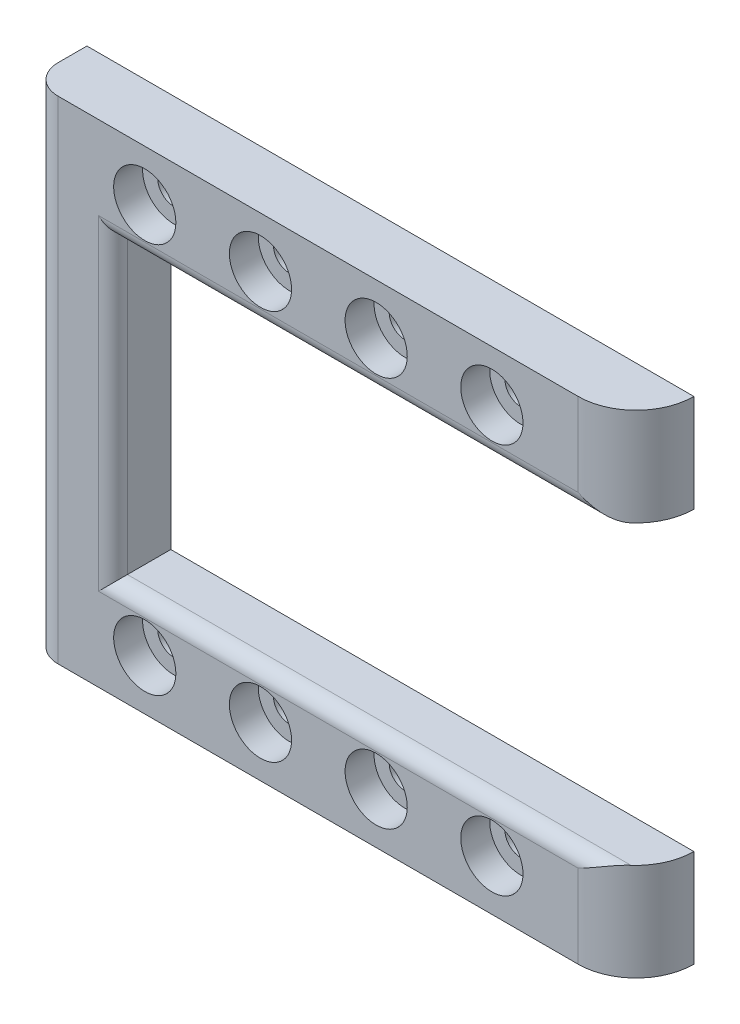
ISO-10303-21;
HEADER;
FILE_DESCRIPTION(('STEP AP214'),'2;1');
FILE_NAME('part.step','',(''),(''),'','','');
FILE_SCHEMA(('AUTOMOTIVE_DESIGN { 1 0 10303 214 1 1 1 1 }'));
ENDSEC;
DATA;
#1=APPLICATION_CONTEXT('core data for automotive mechanical design processes');
#2=APPLICATION_PROTOCOL_DEFINITION('international standard','automotive_design',2000,#1);
#3=PRODUCT_CONTEXT('',#1,'mechanical');
#4=PRODUCT('Part','Part','',(#3));
#5=PRODUCT_RELATED_PRODUCT_CATEGORY('part','',(#4));
#6=PRODUCT_DEFINITION_FORMATION('','',#4);
#7=PRODUCT_DEFINITION_CONTEXT('part definition',#1,'design');
#8=PRODUCT_DEFINITION('design','',#6,#7);
#9=PRODUCT_DEFINITION_SHAPE('','',#8);
#10=(LENGTH_UNIT() NAMED_UNIT(*) SI_UNIT(.MILLI.,.METRE.));
#11=(NAMED_UNIT(*) PLANE_ANGLE_UNIT() SI_UNIT($,.RADIAN.));
#12=(NAMED_UNIT(*) SI_UNIT($,.STERADIAN.) SOLID_ANGLE_UNIT());
#13=UNCERTAINTY_MEASURE_WITH_UNIT(LENGTH_MEASURE(1.E-05),#10,'distance_accuracy_value','');
#14=(GEOMETRIC_REPRESENTATION_CONTEXT(3) GLOBAL_UNCERTAINTY_ASSIGNED_CONTEXT((#13)) GLOBAL_UNIT_ASSIGNED_CONTEXT((#10,
#11,#12)) REPRESENTATION_CONTEXT('',''));
#15=CARTESIAN_POINT('',(0.,0.,0.));
#16=DIRECTION('',(0.,0.,1.));
#17=DIRECTION('',(1.,0.,0.));
#18=AXIS2_PLACEMENT_3D('',#15,#16,#17);
#19=CARTESIAN_POINT('',(-11.25,-13.5,4.));
#20=DIRECTION('',(0.,0.,-1.));
#21=DIRECTION('',(-1.,0.,0.));
#22=AXIS2_PLACEMENT_3D('',#19,#20,#21);
#23=CYLINDRICAL_SURFACE('',#22,1.1);
#24=CARTESIAN_POINT('',(-11.25,-13.5,0.));
#25=DIRECTION('',(0.,0.,1.));
#26=DIRECTION('',(-1.,0.,0.));
#27=AXIS2_PLACEMENT_3D('',#24,#25,#26);
#28=CIRCLE('',#27,1.1);
#29=CARTESIAN_POINT('',(-12.35,-13.5,0.));
#30=VERTEX_POINT('',#29);
#31=EDGE_CURVE('E359',#30,#30,#28,.T.);
#32=ORIENTED_EDGE('',*,*,#31,.F.);
#33=EDGE_LOOP('',(#32));
#34=FACE_BOUND('',#33,.T.);
#35=CARTESIAN_POINT('',(-11.25,-13.5,2.));
#36=DIRECTION('',(0.,0.,1.));
#37=DIRECTION('',(1.,0.,0.));
#38=AXIS2_PLACEMENT_3D('',#35,#36,#37);
#39=CIRCLE('',#38,1.1);
#40=CARTESIAN_POINT('',(-10.15,-13.5,2.));
#41=VERTEX_POINT('',#40);
#42=EDGE_CURVE('E296',#41,#41,#39,.T.);
#43=ORIENTED_EDGE('',*,*,#42,.T.);
#44=EDGE_LOOP('',(#43));
#45=FACE_BOUND('',#44,.T.);
#46=ADVANCED_FACE('F34',(#34,#45),#23,.F.);
#47=CARTESIAN_POINT('',(-3.25,-13.5,4.));
#48=DIRECTION('',(0.,0.,-1.));
#49=DIRECTION('',(-1.,0.,0.));
#50=AXIS2_PLACEMENT_3D('',#47,#48,#49);
#51=CYLINDRICAL_SURFACE('',#50,1.1);
#52=CARTESIAN_POINT('',(-3.25,-13.5,0.));
#53=DIRECTION('',(0.,0.,1.));
#54=DIRECTION('',(-1.,0.,0.));
#55=AXIS2_PLACEMENT_3D('',#52,#53,#54);
#56=CIRCLE('',#55,1.1);
#57=CARTESIAN_POINT('',(-4.35,-13.5,0.));
#58=VERTEX_POINT('',#57);
#59=EDGE_CURVE('E356',#58,#58,#56,.T.);
#60=ORIENTED_EDGE('',*,*,#59,.F.);
#61=EDGE_LOOP('',(#60));
#62=FACE_BOUND('',#61,.T.);
#63=CARTESIAN_POINT('',(-3.25,-13.5,2.));
#64=DIRECTION('',(0.,0.,1.));
#65=DIRECTION('',(1.,0.,0.));
#66=AXIS2_PLACEMENT_3D('',#63,#64,#65);
#67=CIRCLE('',#66,1.1);
#68=CARTESIAN_POINT('',(-2.15,-13.5,2.));
#69=VERTEX_POINT('',#68);
#70=EDGE_CURVE('E301',#69,#69,#67,.T.);
#71=ORIENTED_EDGE('',*,*,#70,.T.);
#72=EDGE_LOOP('',(#71));
#73=FACE_BOUND('',#72,.T.);
#74=ADVANCED_FACE('F192',(#62,#73),#51,.F.);
#75=CARTESIAN_POINT('',(4.75,-13.5,4.));
#76=DIRECTION('',(0.,0.,-1.));
#77=DIRECTION('',(-1.,0.,0.));
#78=AXIS2_PLACEMENT_3D('',#75,#76,#77);
#79=CYLINDRICAL_SURFACE('',#78,1.1);
#80=CARTESIAN_POINT('',(4.75,-13.5,0.));
#81=DIRECTION('',(0.,0.,1.));
#82=DIRECTION('',(-1.,0.,0.));
#83=AXIS2_PLACEMENT_3D('',#80,#81,#82);
#84=CIRCLE('',#83,1.1);
#85=CARTESIAN_POINT('',(3.65,-13.5,0.));
#86=VERTEX_POINT('',#85);
#87=EDGE_CURVE('E353',#86,#86,#84,.T.);
#88=ORIENTED_EDGE('',*,*,#87,.F.);
#89=EDGE_LOOP('',(#88));
#90=FACE_BOUND('',#89,.T.);
#91=CARTESIAN_POINT('',(4.75,-13.5,2.));
#92=DIRECTION('',(0.,0.,1.));
#93=DIRECTION('',(1.,0.,0.));
#94=AXIS2_PLACEMENT_3D('',#91,#92,#93);
#95=CIRCLE('',#94,1.1);
#96=CARTESIAN_POINT('',(5.85,-13.5,2.));
#97=VERTEX_POINT('',#96);
#98=EDGE_CURVE('E308',#97,#97,#95,.T.);
#99=ORIENTED_EDGE('',*,*,#98,.T.);
#100=EDGE_LOOP('',(#99));
#101=FACE_BOUND('',#100,.T.);
#102=ADVANCED_FACE('F198',(#90,#101),#79,.F.);
#103=CARTESIAN_POINT('',(12.75,-13.5,4.));
#104=DIRECTION('',(0.,0.,-1.));
#105=DIRECTION('',(-1.,0.,0.));
#106=AXIS2_PLACEMENT_3D('',#103,#104,#105);
#107=CYLINDRICAL_SURFACE('',#106,1.1);
#108=CARTESIAN_POINT('',(12.75,-13.5,0.));
#109=DIRECTION('',(0.,0.,1.));
#110=DIRECTION('',(-1.,0.,0.));
#111=AXIS2_PLACEMENT_3D('',#108,#109,#110);
#112=CIRCLE('',#111,1.1);
#113=CARTESIAN_POINT('',(11.65,-13.5,0.));
#114=VERTEX_POINT('',#113);
#115=EDGE_CURVE('E349',#114,#114,#112,.T.);
#116=ORIENTED_EDGE('',*,*,#115,.F.);
#117=EDGE_LOOP('',(#116));
#118=FACE_BOUND('',#117,.T.);
#119=CARTESIAN_POINT('',(12.75,-13.5,2.));
#120=DIRECTION('',(0.,0.,1.));
#121=DIRECTION('',(1.,0.,0.));
#122=AXIS2_PLACEMENT_3D('',#119,#120,#121);
#123=CIRCLE('',#122,1.1);
#124=CARTESIAN_POINT('',(13.85,-13.5,2.));
#125=VERTEX_POINT('',#124);
#126=EDGE_CURVE('E315',#125,#125,#123,.T.);
#127=ORIENTED_EDGE('',*,*,#126,.T.);
#128=EDGE_LOOP('',(#127));
#129=FACE_BOUND('',#128,.T.);
#130=ADVANCED_FACE('F209',(#118,#129),#107,.F.);
#131=CARTESIAN_POINT('',(-11.25,13.5,4.));
#132=DIRECTION('',(0.,0.,-1.));
#133=DIRECTION('',(-1.,0.,0.));
#134=AXIS2_PLACEMENT_3D('',#131,#132,#133);
#135=CYLINDRICAL_SURFACE('',#134,1.1);
#136=CARTESIAN_POINT('',(-11.25,13.5,0.));
#137=DIRECTION('',(0.,0.,1.));
#138=DIRECTION('',(1.,0.,0.));
#139=AXIS2_PLACEMENT_3D('',#136,#137,#138);
#140=CIRCLE('',#139,1.1);
#141=CARTESIAN_POINT('',(-10.15,13.5,0.));
#142=VERTEX_POINT('',#141);
#143=EDGE_CURVE('E362',#142,#142,#140,.T.);
#144=ORIENTED_EDGE('',*,*,#143,.F.);
#145=EDGE_LOOP('',(#144));
#146=FACE_BOUND('',#145,.T.);
#147=CARTESIAN_POINT('',(-11.25,13.5,2.));
#148=DIRECTION('',(0.,0.,1.));
#149=DIRECTION('',(1.,0.,0.));
#150=AXIS2_PLACEMENT_3D('',#147,#148,#149);
#151=CIRCLE('',#150,1.1);
#152=CARTESIAN_POINT('',(-10.15,13.5,2.));
#153=VERTEX_POINT('',#152);
#154=EDGE_CURVE('E322',#153,#153,#151,.T.);
#155=ORIENTED_EDGE('',*,*,#154,.T.);
#156=EDGE_LOOP('',(#155));
#157=FACE_BOUND('',#156,.T.);
#158=ADVANCED_FACE('F205',(#146,#157),#135,.F.);
#159=CARTESIAN_POINT('',(-3.25,13.5,4.));
#160=DIRECTION('',(0.,0.,-1.));
#161=DIRECTION('',(-1.,0.,0.));
#162=AXIS2_PLACEMENT_3D('',#159,#160,#161);
#163=CYLINDRICAL_SURFACE('',#162,1.1);
#164=CARTESIAN_POINT('',(-3.25,13.5,0.));
#165=DIRECTION('',(0.,0.,1.));
#166=DIRECTION('',(1.,0.,0.));
#167=AXIS2_PLACEMENT_3D('',#164,#165,#166);
#168=CIRCLE('',#167,1.1);
#169=CARTESIAN_POINT('',(-2.15,13.5,0.));
#170=VERTEX_POINT('',#169);
#171=EDGE_CURVE('E365',#170,#170,#168,.T.);
#172=ORIENTED_EDGE('',*,*,#171,.F.);
#173=EDGE_LOOP('',(#172));
#174=FACE_BOUND('',#173,.T.);
#175=CARTESIAN_POINT('',(-3.25,13.5,2.));
#176=DIRECTION('',(0.,0.,1.));
#177=DIRECTION('',(1.,0.,0.));
#178=AXIS2_PLACEMENT_3D('',#175,#176,#177);
#179=CIRCLE('',#178,1.1);
#180=CARTESIAN_POINT('',(-2.15,13.5,2.));
#181=VERTEX_POINT('',#180);
#182=EDGE_CURVE('E329',#181,#181,#179,.T.);
#183=ORIENTED_EDGE('',*,*,#182,.T.);
#184=EDGE_LOOP('',(#183));
#185=FACE_BOUND('',#184,.T.);
#186=ADVANCED_FACE('F208',(#174,#185),#163,.F.);
#187=CARTESIAN_POINT('',(4.75,13.5,4.));
#188=DIRECTION('',(0.,0.,-1.));
#189=DIRECTION('',(-1.,0.,0.));
#190=AXIS2_PLACEMENT_3D('',#187,#188,#189);
#191=CYLINDRICAL_SURFACE('',#190,1.1);
#192=CARTESIAN_POINT('',(4.75,13.5,0.));
#193=DIRECTION('',(0.,0.,1.));
#194=DIRECTION('',(1.,0.,0.));
#195=AXIS2_PLACEMENT_3D('',#192,#193,#194);
#196=CIRCLE('',#195,1.1);
#197=CARTESIAN_POINT('',(5.85,13.5,0.));
#198=VERTEX_POINT('',#197);
#199=EDGE_CURVE('E368',#198,#198,#196,.T.);
#200=ORIENTED_EDGE('',*,*,#199,.F.);
#201=EDGE_LOOP('',(#200));
#202=FACE_BOUND('',#201,.T.);
#203=CARTESIAN_POINT('',(4.75,13.5,2.));
#204=DIRECTION('',(0.,0.,1.));
#205=DIRECTION('',(1.,0.,0.));
#206=AXIS2_PLACEMENT_3D('',#203,#204,#205);
#207=CIRCLE('',#206,1.1);
#208=CARTESIAN_POINT('',(5.85,13.5,2.));
#209=VERTEX_POINT('',#208);
#210=EDGE_CURVE('E336',#209,#209,#207,.T.);
#211=ORIENTED_EDGE('',*,*,#210,.T.);
#212=EDGE_LOOP('',(#211));
#213=FACE_BOUND('',#212,.T.);
#214=ADVANCED_FACE('F213',(#202,#213),#191,.F.);
#215=CARTESIAN_POINT('',(12.75,13.5,4.));
#216=DIRECTION('',(0.,0.,-1.));
#217=DIRECTION('',(-1.,0.,0.));
#218=AXIS2_PLACEMENT_3D('',#215,#216,#217);
#219=CYLINDRICAL_SURFACE('',#218,1.1);
#220=CARTESIAN_POINT('',(12.75,13.5,0.));
#221=DIRECTION('',(0.,0.,1.));
#222=DIRECTION('',(1.,0.,0.));
#223=AXIS2_PLACEMENT_3D('',#220,#221,#222);
#224=CIRCLE('',#223,1.1);
#225=CARTESIAN_POINT('',(13.85,13.5,0.));
#226=VERTEX_POINT('',#225);
#227=EDGE_CURVE('E371',#226,#226,#224,.T.);
#228=ORIENTED_EDGE('',*,*,#227,.F.);
#229=EDGE_LOOP('',(#228));
#230=FACE_BOUND('',#229,.T.);
#231=CARTESIAN_POINT('',(12.75,13.5,2.));
#232=DIRECTION('',(0.,0.,1.));
#233=DIRECTION('',(1.,0.,0.));
#234=AXIS2_PLACEMENT_3D('',#231,#232,#233);
#235=CIRCLE('',#234,1.1);
#236=CARTESIAN_POINT('',(13.85,13.5,2.));
#237=VERTEX_POINT('',#236);
#238=EDGE_CURVE('E129',#237,#237,#235,.T.);
#239=ORIENTED_EDGE('',*,*,#238,.T.);
#240=EDGE_LOOP('',(#239));
#241=FACE_BOUND('',#240,.T.);
#242=ADVANCED_FACE('F217',(#230,#241),#219,.F.);
#243=CARTESIAN_POINT('',(19.25,0.,4.));
#244=DIRECTION('',(0.,0.,1.));
#245=DIRECTION('',(1.,0.,0.));
#246=AXIS2_PLACEMENT_3D('',#243,#244,#245);
#247=PLANE('',#246);
#248=DIRECTION('',(1.,0.,0.));
#249=VECTOR('',#248,1.);
#250=CARTESIAN_POINT('',(-19.25,-17.,4.));
#251=LINE('',#250,#249);
#252=CARTESIAN_POINT('',(-17.25,-17.,4.));
#253=VERTEX_POINT('',#252);
#254=CARTESIAN_POINT('',(18.72,-17.,4.));
#255=VERTEX_POINT('',#254);
#256=EDGE_CURVE('E247',#253,#255,#251,.T.);
#257=ORIENTED_EDGE('',*,*,#256,.T.);
#258=DIRECTION('',(0.,-1.,0.));
#259=VECTOR('',#258,1.);
#260=CARTESIAN_POINT('',(18.72,0.,4.));
#261=LINE('',#260,#259);
#262=CARTESIAN_POINT('',(18.72,-11.25,4.));
#263=VERTEX_POINT('',#262);
#264=EDGE_CURVE('E273',#255,#263,#261,.F.);
#265=ORIENTED_EDGE('',*,*,#264,.T.);
#266=DIRECTION('',(1.,0.,0.));
#267=VECTOR('',#266,1.);
#268=CARTESIAN_POINT('',(-13.45,-11.25,4.));
#269=LINE('',#268,#267);
#270=CARTESIAN_POINT('',(-14.45,-11.25,4.));
#271=VERTEX_POINT('',#270);
#272=EDGE_CURVE('E251',#263,#271,#269,.F.);
#273=ORIENTED_EDGE('',*,*,#272,.T.);
#274=DIRECTION('',(0.,-1.,0.));
#275=VECTOR('',#274,1.);
#276=CARTESIAN_POINT('',(-14.45,10.25,4.));
#277=LINE('',#276,#275);
#278=CARTESIAN_POINT('',(-14.45,11.25,4.));
#279=VERTEX_POINT('',#278);
#280=EDGE_CURVE('E252',#271,#279,#277,.F.);
#281=ORIENTED_EDGE('',*,*,#280,.T.);
#282=DIRECTION('',(-1.,0.,0.));
#283=VECTOR('',#282,1.);
#284=CARTESIAN_POINT('',(22.72,11.25,4.));
#285=LINE('',#284,#283);
#286=CARTESIAN_POINT('',(18.72,11.25,4.));
#287=VERTEX_POINT('',#286);
#288=EDGE_CURVE('E256',#279,#287,#285,.F.);
#289=ORIENTED_EDGE('',*,*,#288,.T.);
#290=DIRECTION('',(0.,-1.,0.));
#291=VECTOR('',#290,1.);
#292=CARTESIAN_POINT('',(18.72,0.,4.));
#293=LINE('',#292,#291);
#294=CARTESIAN_POINT('',(18.72,17.,4.));
#295=VERTEX_POINT('',#294);
#296=EDGE_CURVE('E250',#287,#295,#293,.F.);
#297=ORIENTED_EDGE('',*,*,#296,.T.);
#298=DIRECTION('',(-1.,0.,0.));
#299=VECTOR('',#298,1.);
#300=CARTESIAN_POINT('',(-19.25,17.,4.));
#301=LINE('',#300,#299);
#302=CARTESIAN_POINT('',(-17.25,17.,4.));
#303=VERTEX_POINT('',#302);
#304=EDGE_CURVE('E243',#295,#303,#301,.T.);
#305=ORIENTED_EDGE('',*,*,#304,.T.);
#306=DIRECTION('',(0.,-1.,0.));
#307=VECTOR('',#306,1.);
#308=CARTESIAN_POINT('',(-17.25,-17.,4.));
#309=LINE('',#308,#307);
#310=EDGE_CURVE('E268',#303,#253,#309,.T.);
#311=ORIENTED_EDGE('',*,*,#310,.T.);
#312=EDGE_LOOP('',(#257,#265,#273,#281,#289,#297,#305,#311));
#313=FACE_BOUND('',#312,.T.);
#314=CARTESIAN_POINT('',(-11.25,-13.5,4.));
#315=DIRECTION('',(0.,0.,1.));
#316=DIRECTION('',(1.,0.,0.));
#317=AXIS2_PLACEMENT_3D('',#314,#315,#316);
#318=CIRCLE('',#317,2.15);
#319=CARTESIAN_POINT('',(-9.1,-13.5,4.));
#320=VERTEX_POINT('',#319);
#321=EDGE_CURVE('E289',#320,#320,#318,.T.);
#322=ORIENTED_EDGE('',*,*,#321,.F.);
#323=EDGE_LOOP('',(#322));
#324=FACE_BOUND('',#323,.T.);
#325=CARTESIAN_POINT('',(-3.25,-13.5,4.));
#326=DIRECTION('',(0.,0.,1.));
#327=DIRECTION('',(1.,0.,0.));
#328=AXIS2_PLACEMENT_3D('',#325,#326,#327);
#329=CIRCLE('',#328,2.15);
#330=CARTESIAN_POINT('',(-1.1,-13.5,4.));
#331=VERTEX_POINT('',#330);
#332=EDGE_CURVE('E302',#331,#331,#329,.T.);
#333=ORIENTED_EDGE('',*,*,#332,.F.);
#334=EDGE_LOOP('',(#333));
#335=FACE_BOUND('',#334,.T.);
#336=CARTESIAN_POINT('',(4.75,-13.5,4.));
#337=DIRECTION('',(0.,0.,1.));
#338=DIRECTION('',(1.,0.,0.));
#339=AXIS2_PLACEMENT_3D('',#336,#337,#338);
#340=CIRCLE('',#339,2.15);
#341=CARTESIAN_POINT('',(6.9,-13.5,4.));
#342=VERTEX_POINT('',#341);
#343=EDGE_CURVE('E309',#342,#342,#340,.T.);
#344=ORIENTED_EDGE('',*,*,#343,.F.);
#345=EDGE_LOOP('',(#344));
#346=FACE_BOUND('',#345,.T.);
#347=CARTESIAN_POINT('',(12.75,-13.5,4.));
#348=DIRECTION('',(0.,0.,1.));
#349=DIRECTION('',(1.,0.,0.));
#350=AXIS2_PLACEMENT_3D('',#347,#348,#349);
#351=CIRCLE('',#350,2.15);
#352=CARTESIAN_POINT('',(14.9,-13.5,4.));
#353=VERTEX_POINT('',#352);
#354=EDGE_CURVE('E316',#353,#353,#351,.T.);
#355=ORIENTED_EDGE('',*,*,#354,.F.);
#356=EDGE_LOOP('',(#355));
#357=FACE_BOUND('',#356,.T.);
#358=CARTESIAN_POINT('',(-11.25,13.5,4.));
#359=DIRECTION('',(0.,0.,1.));
#360=DIRECTION('',(1.,0.,0.));
#361=AXIS2_PLACEMENT_3D('',#358,#359,#360);
#362=CIRCLE('',#361,2.15);
#363=CARTESIAN_POINT('',(-9.1,13.5,4.));
#364=VERTEX_POINT('',#363);
#365=EDGE_CURVE('E323',#364,#364,#362,.T.);
#366=ORIENTED_EDGE('',*,*,#365,.F.);
#367=EDGE_LOOP('',(#366));
#368=FACE_BOUND('',#367,.T.);
#369=CARTESIAN_POINT('',(-3.25,13.5,4.));
#370=DIRECTION('',(0.,0.,1.));
#371=DIRECTION('',(1.,0.,0.));
#372=AXIS2_PLACEMENT_3D('',#369,#370,#371);
#373=CIRCLE('',#372,2.15);
#374=CARTESIAN_POINT('',(-1.1,13.5,4.));
#375=VERTEX_POINT('',#374);
#376=EDGE_CURVE('E330',#375,#375,#373,.T.);
#377=ORIENTED_EDGE('',*,*,#376,.F.);
#378=EDGE_LOOP('',(#377));
#379=FACE_BOUND('',#378,.T.);
#380=CARTESIAN_POINT('',(4.75,13.5,4.));
#381=DIRECTION('',(0.,0.,1.));
#382=DIRECTION('',(1.,0.,0.));
#383=AXIS2_PLACEMENT_3D('',#380,#381,#382);
#384=CIRCLE('',#383,2.15);
#385=CARTESIAN_POINT('',(6.9,13.5,4.));
#386=VERTEX_POINT('',#385);
#387=EDGE_CURVE('E337',#386,#386,#384,.T.);
#388=ORIENTED_EDGE('',*,*,#387,.F.);
#389=EDGE_LOOP('',(#388));
#390=FACE_BOUND('',#389,.T.);
#391=CARTESIAN_POINT('',(12.75,13.5,4.));
#392=DIRECTION('',(0.,0.,1.));
#393=DIRECTION('',(1.,0.,0.));
#394=AXIS2_PLACEMENT_3D('',#391,#392,#393);
#395=CIRCLE('',#394,2.15);
#396=CARTESIAN_POINT('',(14.9,13.5,4.));
#397=VERTEX_POINT('',#396);
#398=EDGE_CURVE('E343',#397,#397,#395,.T.);
#399=ORIENTED_EDGE('',*,*,#398,.F.);
#400=EDGE_LOOP('',(#399));
#401=FACE_BOUND('',#400,.T.);
#402=ADVANCED_FACE('F221',(#313,#324,#335,#346,#357,#368,#379,#390,#401),#247,.T.);
#403=CARTESIAN_POINT('',(19.25,0.,0.));
#404=DIRECTION('',(0.,0.,1.));
#405=DIRECTION('',(1.,0.,0.));
#406=AXIS2_PLACEMENT_3D('',#403,#404,#405);
#407=PLANE('',#406);
#408=ORIENTED_EDGE('',*,*,#87,.T.);
#409=EDGE_LOOP('',(#408));
#410=FACE_BOUND('',#409,.T.);
#411=ORIENTED_EDGE('',*,*,#31,.T.);
#412=EDGE_LOOP('',(#411));
#413=FACE_BOUND('',#412,.T.);
#414=ORIENTED_EDGE('',*,*,#171,.T.);
#415=EDGE_LOOP('',(#414));
#416=FACE_BOUND('',#415,.T.);
#417=ORIENTED_EDGE('',*,*,#227,.T.);
#418=EDGE_LOOP('',(#417));
#419=FACE_BOUND('',#418,.T.);
#420=DIRECTION('',(0.,-1.,0.));
#421=VECTOR('',#420,1.);
#422=CARTESIAN_POINT('',(-13.45,10.25,0.));
#423=LINE('',#422,#421);
#424=CARTESIAN_POINT('',(-13.45,10.25,0.));
#425=VERTEX_POINT('',#424);
#426=CARTESIAN_POINT('',(-13.45,-10.25,0.));
#427=VERTEX_POINT('',#426);
#428=EDGE_CURVE('E128',#425,#427,#423,.T.);
#429=ORIENTED_EDGE('',*,*,#428,.T.);
#430=DIRECTION('',(1.,0.,0.));
#431=VECTOR('',#430,1.);
#432=CARTESIAN_POINT('',(19.25,-10.25,0.));
#433=LINE('',#432,#431);
#434=CARTESIAN_POINT('',(22.72,-10.25,0.));
#435=VERTEX_POINT('',#434);
#436=EDGE_CURVE('E280',#427,#435,#433,.T.);
#437=ORIENTED_EDGE('',*,*,#436,.T.);
#438=DIRECTION('',(0.,1.,0.));
#439=VECTOR('',#438,1.);
#440=CARTESIAN_POINT('',(22.72,-17.,0.));
#441=LINE('',#440,#439);
#442=CARTESIAN_POINT('',(22.72,-17.,0.));
#443=VERTEX_POINT('',#442);
#444=EDGE_CURVE('E141',#443,#435,#441,.T.);
#445=ORIENTED_EDGE('',*,*,#444,.F.);
#446=DIRECTION('',(1.,0.,0.));
#447=VECTOR('',#446,1.);
#448=CARTESIAN_POINT('',(-19.25,-17.,0.));
#449=LINE('',#448,#447);
#450=CARTESIAN_POINT('',(-19.25,-17.,0.));
#451=VERTEX_POINT('',#450);
#452=EDGE_CURVE('E248',#451,#443,#449,.T.);
#453=ORIENTED_EDGE('',*,*,#452,.F.);
#454=DIRECTION('',(0.,-1.,0.));
#455=VECTOR('',#454,1.);
#456=CARTESIAN_POINT('',(-19.25,17.,0.));
#457=LINE('',#456,#455);
#458=CARTESIAN_POINT('',(-19.25,17.,0.));
#459=VERTEX_POINT('',#458);
#460=EDGE_CURVE('E378',#459,#451,#457,.T.);
#461=ORIENTED_EDGE('',*,*,#460,.F.);
#462=DIRECTION('',(-1.,0.,0.));
#463=VECTOR('',#462,1.);
#464=CARTESIAN_POINT('',(-19.25,17.,0.));
#465=LINE('',#464,#463);
#466=CARTESIAN_POINT('',(22.72,17.,0.));
#467=VERTEX_POINT('',#466);
#468=EDGE_CURVE('E138',#467,#459,#465,.T.);
#469=ORIENTED_EDGE('',*,*,#468,.F.);
#470=DIRECTION('',(0.,1.,0.));
#471=VECTOR('',#470,1.);
#472=CARTESIAN_POINT('',(22.72,10.25,0.));
#473=LINE('',#472,#471);
#474=CARTESIAN_POINT('',(22.72,10.25,0.));
#475=VERTEX_POINT('',#474);
#476=EDGE_CURVE('E133',#475,#467,#473,.T.);
#477=ORIENTED_EDGE('',*,*,#476,.F.);
#478=DIRECTION('',(-1.,0.,0.));
#479=VECTOR('',#478,1.);
#480=CARTESIAN_POINT('',(19.25,10.25,0.));
#481=LINE('',#480,#479);
#482=EDGE_CURVE('E120',#475,#425,#481,.T.);
#483=ORIENTED_EDGE('',*,*,#482,.T.);
#484=EDGE_LOOP('',(#429,#437,#445,#453,#461,#469,#477,#483));
#485=FACE_BOUND('',#484,.T.);
#486=ORIENTED_EDGE('',*,*,#199,.T.);
#487=EDGE_LOOP('',(#486));
#488=FACE_BOUND('',#487,.T.);
#489=ORIENTED_EDGE('',*,*,#143,.T.);
#490=EDGE_LOOP('',(#489));
#491=FACE_BOUND('',#490,.T.);
#492=ORIENTED_EDGE('',*,*,#59,.T.);
#493=EDGE_LOOP('',(#492));
#494=FACE_BOUND('',#493,.T.);
#495=ORIENTED_EDGE('',*,*,#115,.T.);
#496=EDGE_LOOP('',(#495));
#497=FACE_BOUND('',#496,.T.);
#498=ADVANCED_FACE('F134',(#410,#413,#416,#419,#485,#488,#491,#494,#497),#407,.F.);
#499=CARTESIAN_POINT('',(-19.25,17.,4.));
#500=DIRECTION('',(0.,-1.,0.));
#501=DIRECTION('',(0.,0.,-1.));
#502=AXIS2_PLACEMENT_3D('',#499,#500,#501);
#503=PLANE('',#502);
#504=ORIENTED_EDGE('',*,*,#304,.F.);
#505=CARTESIAN_POINT('',(18.72,17.,0.));
#506=DIRECTION('',(0.,-1.,0.));
#507=DIRECTION('',(0.,0.,-1.));
#508=AXIS2_PLACEMENT_3D('',#505,#506,#507);
#509=CIRCLE('',#508,4.);
#510=EDGE_CURVE('E150',#295,#467,#509,.F.);
#511=ORIENTED_EDGE('',*,*,#510,.T.);
#512=ORIENTED_EDGE('',*,*,#468,.T.);
#513=DIRECTION('',(0.,0.,-1.));
#514=VECTOR('',#513,1.);
#515=CARTESIAN_POINT('',(-19.25,17.,4.));
#516=LINE('',#515,#514);
#517=CARTESIAN_POINT('',(-19.25,17.,2.));
#518=VERTEX_POINT('',#517);
#519=EDGE_CURVE('E383',#518,#459,#516,.T.);
#520=ORIENTED_EDGE('',*,*,#519,.F.);
#521=CARTESIAN_POINT('',(-17.25,17.,2.));
#522=DIRECTION('',(0.,-1.,0.));
#523=DIRECTION('',(0.,0.,-1.));
#524=AXIS2_PLACEMENT_3D('',#521,#522,#523);
#525=CIRCLE('',#524,2.);
#526=EDGE_CURVE('E147',#518,#303,#525,.F.);
#527=ORIENTED_EDGE('',*,*,#526,.T.);
#528=EDGE_LOOP('',(#504,#511,#512,#520,#527));
#529=FACE_BOUND('',#528,.T.);
#530=ADVANCED_FACE('F228',(#529),#503,.F.);
#531=CARTESIAN_POINT('',(-19.25,17.,4.));
#532=DIRECTION('',(1.,0.,0.));
#533=DIRECTION('',(0.,1.,0.));
#534=AXIS2_PLACEMENT_3D('',#531,#532,#533);
#535=PLANE('',#534);
#536=DIRECTION('',(0.,0.,-1.));
#537=VECTOR('',#536,1.);
#538=CARTESIAN_POINT('',(-19.25,-17.,4.));
#539=LINE('',#538,#537);
#540=CARTESIAN_POINT('',(-19.25,-17.,2.));
#541=VERTEX_POINT('',#540);
#542=EDGE_CURVE('E376',#541,#451,#539,.T.);
#543=ORIENTED_EDGE('',*,*,#542,.F.);
#544=DIRECTION('',(0.,-1.,0.));
#545=VECTOR('',#544,1.);
#546=CARTESIAN_POINT('',(-19.25,17.,2.));
#547=LINE('',#546,#545);
#548=EDGE_CURVE('E12',#541,#518,#547,.F.);
#549=ORIENTED_EDGE('',*,*,#548,.T.);
#550=ORIENTED_EDGE('',*,*,#519,.T.);
#551=ORIENTED_EDGE('',*,*,#460,.T.);
#552=EDGE_LOOP('',(#543,#549,#550,#551));
#553=FACE_BOUND('',#552,.T.);
#554=ADVANCED_FACE('F234',(#553),#535,.F.);
#555=CARTESIAN_POINT('',(-19.25,-17.,4.));
#556=DIRECTION('',(0.,1.,0.));
#557=DIRECTION('',(-1.,0.,0.));
#558=AXIS2_PLACEMENT_3D('',#555,#556,#557);
#559=PLANE('',#558);
#560=ORIENTED_EDGE('',*,*,#452,.T.);
#561=CARTESIAN_POINT('',(18.72,-17.,0.));
#562=DIRECTION('',(0.,1.,0.));
#563=DIRECTION('',(-1.,0.,0.));
#564=AXIS2_PLACEMENT_3D('',#561,#562,#563);
#565=CIRCLE('',#564,4.);
#566=EDGE_CURVE('E287',#443,#255,#565,.F.);
#567=ORIENTED_EDGE('',*,*,#566,.T.);
#568=ORIENTED_EDGE('',*,*,#256,.F.);
#569=CARTESIAN_POINT('',(-17.25,-17.,2.));
#570=DIRECTION('',(0.,1.,0.));
#571=DIRECTION('',(-1.,0.,0.));
#572=AXIS2_PLACEMENT_3D('',#569,#570,#571);
#573=CIRCLE('',#572,2.);
#574=EDGE_CURVE('E385',#253,#541,#573,.F.);
#575=ORIENTED_EDGE('',*,*,#574,.T.);
#576=ORIENTED_EDGE('',*,*,#542,.T.);
#577=EDGE_LOOP('',(#560,#567,#568,#575,#576));
#578=FACE_BOUND('',#577,.T.);
#579=ADVANCED_FACE('F230',(#578),#559,.F.);
#580=CARTESIAN_POINT('',(19.25,-10.25,0.));
#581=DIRECTION('',(0.,-1.,0.));
#582=DIRECTION('',(1.,0.,0.));
#583=AXIS2_PLACEMENT_3D('',#580,#581,#582);
#584=PLANE('',#583);
#585=DIRECTION('',(1.,0.,0.));
#586=VECTOR('',#585,1.);
#587=CARTESIAN_POINT('',(22.72,-10.25,3.));
#588=LINE('',#587,#586);
#589=CARTESIAN_POINT('',(-13.45,-10.25,3.));
#590=VERTEX_POINT('',#589);
#591=CARTESIAN_POINT('',(21.3657513110646,-10.25,3.));
#592=VERTEX_POINT('',#591);
#593=EDGE_CURVE('E266',#590,#592,#588,.T.);
#594=ORIENTED_EDGE('',*,*,#593,.T.);
#595=CARTESIAN_POINT('',(18.72,-10.25,0.));
#596=DIRECTION('',(0.,-1.,0.));
#597=DIRECTION('',(1.,0.,0.));
#598=AXIS2_PLACEMENT_3D('',#595,#596,#597);
#599=CIRCLE('',#598,4.);
#600=EDGE_CURVE('E152',#592,#435,#599,.F.);
#601=ORIENTED_EDGE('',*,*,#600,.T.);
#602=ORIENTED_EDGE('',*,*,#436,.F.);
#603=DIRECTION('',(0.,0.,1.));
#604=VECTOR('',#603,1.);
#605=CARTESIAN_POINT('',(-13.45,-10.25,0.));
#606=LINE('',#605,#604);
#607=EDGE_CURVE('E347',#427,#590,#606,.T.);
#608=ORIENTED_EDGE('',*,*,#607,.T.);
#609=EDGE_LOOP('',(#594,#601,#602,#608));
#610=FACE_BOUND('',#609,.T.);
#611=ADVANCED_FACE('F233',(#610),#584,.F.);
#612=CARTESIAN_POINT('',(-13.45,10.25,0.));
#613=DIRECTION('',(-1.,0.,0.));
#614=DIRECTION('',(0.,0.,1.));
#615=AXIS2_PLACEMENT_3D('',#612,#613,#614);
#616=PLANE('',#615);
#617=DIRECTION('',(0.,0.,1.));
#618=VECTOR('',#617,1.);
#619=CARTESIAN_POINT('',(-13.45,10.25,0.));
#620=LINE('',#619,#618);
#621=CARTESIAN_POINT('',(-13.45,10.25,3.));
#622=VERTEX_POINT('',#621);
#623=EDGE_CURVE('E124',#425,#622,#620,.T.);
#624=ORIENTED_EDGE('',*,*,#623,.T.);
#625=DIRECTION('',(0.,-1.,0.));
#626=VECTOR('',#625,1.);
#627=CARTESIAN_POINT('',(-13.45,-10.25,3.));
#628=LINE('',#627,#626);
#629=EDGE_CURVE('E47',#622,#590,#628,.T.);
#630=ORIENTED_EDGE('',*,*,#629,.T.);
#631=ORIENTED_EDGE('',*,*,#607,.F.);
#632=ORIENTED_EDGE('',*,*,#428,.F.);
#633=EDGE_LOOP('',(#624,#630,#631,#632));
#634=FACE_BOUND('',#633,.T.);
#635=ADVANCED_FACE('F438',(#634),#616,.F.);
#636=CARTESIAN_POINT('',(19.25,10.25,0.));
#637=DIRECTION('',(0.,1.,0.));
#638=DIRECTION('',(-1.,0.,0.));
#639=AXIS2_PLACEMENT_3D('',#636,#637,#638);
#640=PLANE('',#639);
#641=ORIENTED_EDGE('',*,*,#482,.F.);
#642=CARTESIAN_POINT('',(18.72,10.25,0.));
#643=DIRECTION('',(0.,1.,0.));
#644=DIRECTION('',(-1.,0.,0.));
#645=AXIS2_PLACEMENT_3D('',#642,#643,#644);
#646=CIRCLE('',#645,4.);
#647=CARTESIAN_POINT('',(21.3657513110646,10.25,3.));
#648=VERTEX_POINT('',#647);
#649=EDGE_CURVE('E61',#475,#648,#646,.F.);
#650=ORIENTED_EDGE('',*,*,#649,.T.);
#651=DIRECTION('',(-1.,0.,0.));
#652=VECTOR('',#651,1.);
#653=CARTESIAN_POINT('',(-13.45,10.25,3.));
#654=LINE('',#653,#652);
#655=EDGE_CURVE('E148',#648,#622,#654,.T.);
#656=ORIENTED_EDGE('',*,*,#655,.T.);
#657=ORIENTED_EDGE('',*,*,#623,.F.);
#658=EDGE_LOOP('',(#641,#650,#656,#657));
#659=FACE_BOUND('',#658,.T.);
#660=ADVANCED_FACE('F122',(#659),#640,.F.);
#661=CARTESIAN_POINT('',(12.75,13.5,2.));
#662=DIRECTION('',(0.,0.,1.));
#663=DIRECTION('',(1.,0.,0.));
#664=AXIS2_PLACEMENT_3D('',#661,#662,#663);
#665=CYLINDRICAL_SURFACE('',#664,2.15);
#666=CARTESIAN_POINT('',(12.75,13.5,2.));
#667=DIRECTION('',(0.,0.,1.));
#668=DIRECTION('',(1.,0.,0.));
#669=AXIS2_PLACEMENT_3D('',#666,#667,#668);
#670=CIRCLE('',#669,2.15);
#671=CARTESIAN_POINT('',(14.9,13.5,2.));
#672=VERTEX_POINT('',#671);
#673=EDGE_CURVE('E340',#672,#672,#670,.T.);
#674=ORIENTED_EDGE('',*,*,#673,.F.);
#675=EDGE_LOOP('',(#674));
#676=FACE_BOUND('',#675,.T.);
#677=ORIENTED_EDGE('',*,*,#398,.T.);
#678=EDGE_LOOP('',(#677));
#679=FACE_BOUND('',#678,.T.);
#680=ADVANCED_FACE('F437',(#676,#679),#665,.F.);
#681=CARTESIAN_POINT('',(12.75,13.5,2.));
#682=DIRECTION('',(0.,0.,1.));
#683=DIRECTION('',(1.,0.,0.));
#684=AXIS2_PLACEMENT_3D('',#681,#682,#683);
#685=PLANE('',#684);
#686=ORIENTED_EDGE('',*,*,#238,.F.);
#687=EDGE_LOOP('',(#686));
#688=FACE_BOUND('',#687,.T.);
#689=ORIENTED_EDGE('',*,*,#673,.T.);
#690=EDGE_LOOP('',(#689));
#691=FACE_BOUND('',#690,.T.);
#692=ADVANCED_FACE('F625',(#688,#691),#685,.T.);
#693=CARTESIAN_POINT('',(4.75,13.5,2.));
#694=DIRECTION('',(0.,0.,1.));
#695=DIRECTION('',(1.,0.,0.));
#696=AXIS2_PLACEMENT_3D('',#693,#694,#695);
#697=CYLINDRICAL_SURFACE('',#696,2.15);
#698=CARTESIAN_POINT('',(4.75,13.5,2.));
#699=DIRECTION('',(0.,0.,1.));
#700=DIRECTION('',(1.,0.,0.));
#701=AXIS2_PLACEMENT_3D('',#698,#699,#700);
#702=CIRCLE('',#701,2.15);
#703=CARTESIAN_POINT('',(6.9,13.5,2.));
#704=VERTEX_POINT('',#703);
#705=EDGE_CURVE('E333',#704,#704,#702,.T.);
#706=ORIENTED_EDGE('',*,*,#705,.F.);
#707=EDGE_LOOP('',(#706));
#708=FACE_BOUND('',#707,.T.);
#709=ORIENTED_EDGE('',*,*,#387,.T.);
#710=EDGE_LOOP('',(#709));
#711=FACE_BOUND('',#710,.T.);
#712=ADVANCED_FACE('F615',(#708,#711),#697,.F.);
#713=CARTESIAN_POINT('',(4.75,13.5,2.));
#714=DIRECTION('',(0.,0.,1.));
#715=DIRECTION('',(1.,0.,0.));
#716=AXIS2_PLACEMENT_3D('',#713,#714,#715);
#717=PLANE('',#716);
#718=ORIENTED_EDGE('',*,*,#210,.F.);
#719=EDGE_LOOP('',(#718));
#720=FACE_BOUND('',#719,.T.);
#721=ORIENTED_EDGE('',*,*,#705,.T.);
#722=EDGE_LOOP('',(#721));
#723=FACE_BOUND('',#722,.T.);
#724=ADVANCED_FACE('F605',(#720,#723),#717,.T.);
#725=CARTESIAN_POINT('',(-3.25,13.5,2.));
#726=DIRECTION('',(0.,0.,1.));
#727=DIRECTION('',(1.,0.,0.));
#728=AXIS2_PLACEMENT_3D('',#725,#726,#727);
#729=CYLINDRICAL_SURFACE('',#728,2.15);
#730=CARTESIAN_POINT('',(-3.25,13.5,2.));
#731=DIRECTION('',(0.,0.,1.));
#732=DIRECTION('',(1.,0.,0.));
#733=AXIS2_PLACEMENT_3D('',#730,#731,#732);
#734=CIRCLE('',#733,2.15);
#735=CARTESIAN_POINT('',(-1.1,13.5,2.));
#736=VERTEX_POINT('',#735);
#737=EDGE_CURVE('E326',#736,#736,#734,.T.);
#738=ORIENTED_EDGE('',*,*,#737,.F.);
#739=EDGE_LOOP('',(#738));
#740=FACE_BOUND('',#739,.T.);
#741=ORIENTED_EDGE('',*,*,#376,.T.);
#742=EDGE_LOOP('',(#741));
#743=FACE_BOUND('',#742,.T.);
#744=ADVANCED_FACE('F595',(#740,#743),#729,.F.);
#745=CARTESIAN_POINT('',(-3.25,13.5,2.));
#746=DIRECTION('',(0.,0.,1.));
#747=DIRECTION('',(1.,0.,0.));
#748=AXIS2_PLACEMENT_3D('',#745,#746,#747);
#749=PLANE('',#748);
#750=ORIENTED_EDGE('',*,*,#182,.F.);
#751=EDGE_LOOP('',(#750));
#752=FACE_BOUND('',#751,.T.);
#753=ORIENTED_EDGE('',*,*,#737,.T.);
#754=EDGE_LOOP('',(#753));
#755=FACE_BOUND('',#754,.T.);
#756=ADVANCED_FACE('F585',(#752,#755),#749,.T.);
#757=CARTESIAN_POINT('',(-11.25,13.5,2.));
#758=DIRECTION('',(0.,0.,1.));
#759=DIRECTION('',(1.,0.,0.));
#760=AXIS2_PLACEMENT_3D('',#757,#758,#759);
#761=CYLINDRICAL_SURFACE('',#760,2.15);
#762=CARTESIAN_POINT('',(-11.25,13.5,2.));
#763=DIRECTION('',(0.,0.,1.));
#764=DIRECTION('',(1.,0.,0.));
#765=AXIS2_PLACEMENT_3D('',#762,#763,#764);
#766=CIRCLE('',#765,2.15);
#767=CARTESIAN_POINT('',(-9.1,13.5,2.));
#768=VERTEX_POINT('',#767);
#769=EDGE_CURVE('E319',#768,#768,#766,.T.);
#770=ORIENTED_EDGE('',*,*,#769,.F.);
#771=EDGE_LOOP('',(#770));
#772=FACE_BOUND('',#771,.T.);
#773=ORIENTED_EDGE('',*,*,#365,.T.);
#774=EDGE_LOOP('',(#773));
#775=FACE_BOUND('',#774,.T.);
#776=ADVANCED_FACE('F575',(#772,#775),#761,.F.);
#777=CARTESIAN_POINT('',(-11.25,13.5,2.));
#778=DIRECTION('',(0.,0.,1.));
#779=DIRECTION('',(1.,0.,0.));
#780=AXIS2_PLACEMENT_3D('',#777,#778,#779);
#781=PLANE('',#780);
#782=ORIENTED_EDGE('',*,*,#154,.F.);
#783=EDGE_LOOP('',(#782));
#784=FACE_BOUND('',#783,.T.);
#785=ORIENTED_EDGE('',*,*,#769,.T.);
#786=EDGE_LOOP('',(#785));
#787=FACE_BOUND('',#786,.T.);
#788=ADVANCED_FACE('F565',(#784,#787),#781,.T.);
#789=CARTESIAN_POINT('',(12.75,-13.5,2.));
#790=DIRECTION('',(0.,0.,1.));
#791=DIRECTION('',(1.,0.,0.));
#792=AXIS2_PLACEMENT_3D('',#789,#790,#791);
#793=CYLINDRICAL_SURFACE('',#792,2.15);
#794=CARTESIAN_POINT('',(12.75,-13.5,2.));
#795=DIRECTION('',(0.,0.,1.));
#796=DIRECTION('',(1.,0.,0.));
#797=AXIS2_PLACEMENT_3D('',#794,#795,#796);
#798=CIRCLE('',#797,2.15);
#799=CARTESIAN_POINT('',(14.9,-13.5,2.));
#800=VERTEX_POINT('',#799);
#801=EDGE_CURVE('E312',#800,#800,#798,.T.);
#802=ORIENTED_EDGE('',*,*,#801,.F.);
#803=EDGE_LOOP('',(#802));
#804=FACE_BOUND('',#803,.T.);
#805=ORIENTED_EDGE('',*,*,#354,.T.);
#806=EDGE_LOOP('',(#805));
#807=FACE_BOUND('',#806,.T.);
#808=ADVANCED_FACE('F555',(#804,#807),#793,.F.);
#809=CARTESIAN_POINT('',(12.75,-13.5,2.));
#810=DIRECTION('',(0.,0.,1.));
#811=DIRECTION('',(1.,0.,0.));
#812=AXIS2_PLACEMENT_3D('',#809,#810,#811);
#813=PLANE('',#812);
#814=ORIENTED_EDGE('',*,*,#126,.F.);
#815=EDGE_LOOP('',(#814));
#816=FACE_BOUND('',#815,.T.);
#817=ORIENTED_EDGE('',*,*,#801,.T.);
#818=EDGE_LOOP('',(#817));
#819=FACE_BOUND('',#818,.T.);
#820=ADVANCED_FACE('F545',(#816,#819),#813,.T.);
#821=CARTESIAN_POINT('',(4.75,-13.5,2.));
#822=DIRECTION('',(0.,0.,1.));
#823=DIRECTION('',(1.,0.,0.));
#824=AXIS2_PLACEMENT_3D('',#821,#822,#823);
#825=CYLINDRICAL_SURFACE('',#824,2.15);
#826=CARTESIAN_POINT('',(4.75,-13.5,2.));
#827=DIRECTION('',(0.,0.,1.));
#828=DIRECTION('',(1.,0.,0.));
#829=AXIS2_PLACEMENT_3D('',#826,#827,#828);
#830=CIRCLE('',#829,2.15);
#831=CARTESIAN_POINT('',(6.9,-13.5,2.));
#832=VERTEX_POINT('',#831);
#833=EDGE_CURVE('E305',#832,#832,#830,.T.);
#834=ORIENTED_EDGE('',*,*,#833,.F.);
#835=EDGE_LOOP('',(#834));
#836=FACE_BOUND('',#835,.T.);
#837=ORIENTED_EDGE('',*,*,#343,.T.);
#838=EDGE_LOOP('',(#837));
#839=FACE_BOUND('',#838,.T.);
#840=ADVANCED_FACE('F535',(#836,#839),#825,.F.);
#841=CARTESIAN_POINT('',(4.75,-13.5,2.));
#842=DIRECTION('',(0.,0.,1.));
#843=DIRECTION('',(1.,0.,0.));
#844=AXIS2_PLACEMENT_3D('',#841,#842,#843);
#845=PLANE('',#844);
#846=ORIENTED_EDGE('',*,*,#98,.F.);
#847=EDGE_LOOP('',(#846));
#848=FACE_BOUND('',#847,.T.);
#849=ORIENTED_EDGE('',*,*,#833,.T.);
#850=EDGE_LOOP('',(#849));
#851=FACE_BOUND('',#850,.T.);
#852=ADVANCED_FACE('F525',(#848,#851),#845,.T.);
#853=CARTESIAN_POINT('',(-3.25,-13.5,2.));
#854=DIRECTION('',(0.,0.,1.));
#855=DIRECTION('',(1.,0.,0.));
#856=AXIS2_PLACEMENT_3D('',#853,#854,#855);
#857=CYLINDRICAL_SURFACE('',#856,2.15);
#858=CARTESIAN_POINT('',(-3.25,-13.5,2.));
#859=DIRECTION('',(0.,0.,1.));
#860=DIRECTION('',(1.,0.,0.));
#861=AXIS2_PLACEMENT_3D('',#858,#859,#860);
#862=CIRCLE('',#861,2.15);
#863=CARTESIAN_POINT('',(-1.1,-13.5,2.));
#864=VERTEX_POINT('',#863);
#865=EDGE_CURVE('E298',#864,#864,#862,.T.);
#866=ORIENTED_EDGE('',*,*,#865,.F.);
#867=EDGE_LOOP('',(#866));
#868=FACE_BOUND('',#867,.T.);
#869=ORIENTED_EDGE('',*,*,#332,.T.);
#870=EDGE_LOOP('',(#869));
#871=FACE_BOUND('',#870,.T.);
#872=ADVANCED_FACE('F515',(#868,#871),#857,.F.);
#873=CARTESIAN_POINT('',(-3.25,-13.5,2.));
#874=DIRECTION('',(0.,0.,1.));
#875=DIRECTION('',(1.,0.,0.));
#876=AXIS2_PLACEMENT_3D('',#873,#874,#875);
#877=PLANE('',#876);
#878=ORIENTED_EDGE('',*,*,#70,.F.);
#879=EDGE_LOOP('',(#878));
#880=FACE_BOUND('',#879,.T.);
#881=ORIENTED_EDGE('',*,*,#865,.T.);
#882=EDGE_LOOP('',(#881));
#883=FACE_BOUND('',#882,.T.);
#884=ADVANCED_FACE('F505',(#880,#883),#877,.T.);
#885=CARTESIAN_POINT('',(-11.25,-13.5,2.));
#886=DIRECTION('',(0.,0.,1.));
#887=DIRECTION('',(1.,0.,0.));
#888=AXIS2_PLACEMENT_3D('',#885,#886,#887);
#889=CYLINDRICAL_SURFACE('',#888,2.15);
#890=CARTESIAN_POINT('',(-11.25,-13.5,2.));
#891=DIRECTION('',(0.,0.,1.));
#892=DIRECTION('',(1.,0.,0.));
#893=AXIS2_PLACEMENT_3D('',#890,#891,#892);
#894=CIRCLE('',#893,2.15);
#895=CARTESIAN_POINT('',(-9.1,-13.5,2.));
#896=VERTEX_POINT('',#895);
#897=EDGE_CURVE('E292',#896,#896,#894,.T.);
#898=ORIENTED_EDGE('',*,*,#897,.F.);
#899=EDGE_LOOP('',(#898));
#900=FACE_BOUND('',#899,.T.);
#901=ORIENTED_EDGE('',*,*,#321,.T.);
#902=EDGE_LOOP('',(#901));
#903=FACE_BOUND('',#902,.T.);
#904=ADVANCED_FACE('F188',(#900,#903),#889,.F.);
#905=CARTESIAN_POINT('',(-11.25,-13.5,2.));
#906=DIRECTION('',(0.,0.,1.));
#907=DIRECTION('',(1.,0.,0.));
#908=AXIS2_PLACEMENT_3D('',#905,#906,#907);
#909=PLANE('',#908);
#910=ORIENTED_EDGE('',*,*,#42,.F.);
#911=EDGE_LOOP('',(#910));
#912=FACE_BOUND('',#911,.T.);
#913=ORIENTED_EDGE('',*,*,#897,.T.);
#914=EDGE_LOOP('',(#913));
#915=FACE_BOUND('',#914,.T.);
#916=ADVANCED_FACE('F184',(#912,#915),#909,.T.);
#917=CARTESIAN_POINT('',(18.72,17.,0.));
#918=DIRECTION('',(0.,-1.,0.));
#919=DIRECTION('',(0.,0.,-1.));
#920=AXIS2_PLACEMENT_3D('',#917,#918,#919);
#921=CYLINDRICAL_SURFACE('',#920,4.);
#922=ORIENTED_EDGE('',*,*,#510,.F.);
#923=ORIENTED_EDGE('',*,*,#296,.F.);
#924=CARTESIAN_POINT('',(21.3657513110646,10.25,3.));
#925=CARTESIAN_POINT('',(21.3169164307485,10.2500222582877,3.04308129480157));
#926=CARTESIAN_POINT('',(21.2670662863803,10.2527813130515,3.08491225799032));
#927=CARTESIAN_POINT('',(21.1657784313871,10.262996067094,3.16580783830628));
#928=CARTESIAN_POINT('',(21.114343948769,10.2704427489323,3.20487760691704));
#929=CARTESIAN_POINT('',(21.0105622163421,10.2891856104889,3.27984708807141));
#930=CARTESIAN_POINT('',(20.9582257271935,10.3004501374584,3.31576990398973));
#931=CARTESIAN_POINT('',(20.8524542072541,10.3262500975186,3.38476417266403));
#932=CARTESIAN_POINT('',(20.7990184755056,10.3407876804458,3.41783373148198));
#933=CARTESIAN_POINT('',(20.6612813319672,10.3814716965641,3.4986969044509));
#934=CARTESIAN_POINT('',(20.5763496227672,10.4095766262349,3.54444475089207));
#935=CARTESIAN_POINT('',(20.4049491079581,10.4708922017166,3.62906229291346));
#936=CARTESIAN_POINT('',(20.3184797717321,10.5041046415409,3.66792956133092));
#937=CARTESIAN_POINT('',(20.0565281693828,10.6098954985172,3.77483346479732));
#938=CARTESIAN_POINT('',(19.879225445797,10.688393914262,3.83275455689396));
#939=CARTESIAN_POINT('',(19.5402276098295,10.8456023759214,3.91850936729907));
#940=CARTESIAN_POINT('',(19.3787373697278,10.9235122093992,3.94876568976602));
#941=CARTESIAN_POINT('',(19.0552231802152,11.0824153646891,3.98924683415775));
#942=CARTESIAN_POINT('',(18.8932019026984,11.163399659939,3.99952627499348));
#943=CARTESIAN_POINT('',(18.7275424020223,11.2462288021144,3.99999466301337));
#944=CARTESIAN_POINT('',(18.7237711609846,11.2481144227621,3.99999999589318));
#945=CARTESIAN_POINT('',(18.72,11.25,4.));
#946=B_SPLINE_CURVE_WITH_KNOTS('',3,(#924,#925,#926,#927,#928,#929,#930,#931,#932,#933,#934,
#935,#936,#937,#938,#939,#940,#941,#942,#943,#944,#945),.UNSPECIFIED.,.F.,.F.,(4,2,2,2,2,2,2,2,
2,2,4),(0.,0.195194368709639,0.390014390845265,0.583257193291286,0.776627295352244,
1.07759313237773,1.37866492615878,1.98338003354344,2.5278495985784,3.07082842010451,
3.08347754086454),.UNSPECIFIED.);
#947=EDGE_CURVE('E38',#648,#287,#946,.T.);
#948=ORIENTED_EDGE('',*,*,#947,.F.);
#949=ORIENTED_EDGE('',*,*,#649,.F.);
#950=ORIENTED_EDGE('',*,*,#476,.T.);
#951=EDGE_LOOP('',(#922,#923,#948,#949,#950));
#952=FACE_BOUND('',#951,.T.);
#953=ADVANCED_FACE('F143',(#952),#921,.T.);
#954=CARTESIAN_POINT('',(19.25,11.25,3.));
#955=DIRECTION('',(1.,0.,0.));
#956=DIRECTION('',(0.,1.,0.));
#957=AXIS2_PLACEMENT_3D('',#954,#955,#956);
#958=CYLINDRICAL_SURFACE('',#957,1.);
#959=ORIENTED_EDGE('',*,*,#947,.T.);
#960=ORIENTED_EDGE('',*,*,#288,.F.);
#961=CARTESIAN_POINT('',(-14.45,11.25,3.));
#962=DIRECTION('',(0.707106781186548,0.707106781186547,0.));
#963=DIRECTION('',(-0.707106781186547,0.707106781186547,0.));
#964=AXIS2_PLACEMENT_3D('',#961,#962,#963);
#965=ELLIPSE('',#964,1.4142135623731,1.);
#966=EDGE_CURVE('E258',#622,#279,#965,.F.);
#967=ORIENTED_EDGE('',*,*,#966,.F.);
#968=ORIENTED_EDGE('',*,*,#655,.F.);
#969=EDGE_LOOP('',(#959,#960,#967,#968));
#970=FACE_BOUND('',#969,.T.);
#971=ADVANCED_FACE('F177',(#970),#958,.T.);
#972=CARTESIAN_POINT('',(-14.45,10.25,3.));
#973=DIRECTION('',(0.,1.,0.));
#974=DIRECTION('',(0.,0.,1.));
#975=AXIS2_PLACEMENT_3D('',#972,#973,#974);
#976=CYLINDRICAL_SURFACE('',#975,1.);
#977=ORIENTED_EDGE('',*,*,#966,.T.);
#978=ORIENTED_EDGE('',*,*,#280,.F.);
#979=CARTESIAN_POINT('',(-14.45,-11.25,3.));
#980=DIRECTION('',(-0.707106781186548,0.707106781186547,0.));
#981=DIRECTION('',(0.707106781186547,0.707106781186547,0.));
#982=AXIS2_PLACEMENT_3D('',#979,#980,#981);
#983=ELLIPSE('',#982,1.4142135623731,1.);
#984=EDGE_CURVE('E166',#590,#271,#983,.F.);
#985=ORIENTED_EDGE('',*,*,#984,.F.);
#986=ORIENTED_EDGE('',*,*,#629,.F.);
#987=EDGE_LOOP('',(#977,#978,#985,#986));
#988=FACE_BOUND('',#987,.T.);
#989=ADVANCED_FACE('F174',(#988),#976,.T.);
#990=CARTESIAN_POINT('',(19.25,-11.25,3.));
#991=DIRECTION('',(-1.,0.,0.));
#992=DIRECTION('',(0.,-1.,0.));
#993=AXIS2_PLACEMENT_3D('',#990,#991,#992);
#994=CYLINDRICAL_SURFACE('',#993,1.);
#995=ORIENTED_EDGE('',*,*,#984,.T.);
#996=ORIENTED_EDGE('',*,*,#272,.F.);
#997=CARTESIAN_POINT('',(21.3657513110646,-10.25,3.));
#998=CARTESIAN_POINT('',(21.3169164307485,-10.2500222582877,3.04308129480157));
#999=CARTESIAN_POINT('',(21.2670662863803,-10.2527813130515,3.08491225799032));
#1000=CARTESIAN_POINT('',(21.1657784313871,-10.262996067094,3.16580783830628));
#1001=CARTESIAN_POINT('',(21.114343948769,-10.2704427489323,3.20487760691704));
#1002=CARTESIAN_POINT('',(21.0105622163421,-10.2891856104889,3.27984708807141));
#1003=CARTESIAN_POINT('',(20.9582257271935,-10.3004501374584,3.31576990398973));
#1004=CARTESIAN_POINT('',(20.8524542072541,-10.3262500975186,3.38476417266403));
#1005=CARTESIAN_POINT('',(20.7990184755056,-10.3407876804458,3.41783373148198));
#1006=CARTESIAN_POINT('',(20.6612813319672,-10.3814716965641,3.4986969044509));
#1007=CARTESIAN_POINT('',(20.5763496227672,-10.4095766262349,3.54444475089207));
#1008=CARTESIAN_POINT('',(20.4049491079581,-10.4708922017166,3.62906229291346));
#1009=CARTESIAN_POINT('',(20.3184797717321,-10.5041046415409,3.66792956133092));
#1010=CARTESIAN_POINT('',(20.0565281693828,-10.6098954985172,3.77483346479732));
#1011=CARTESIAN_POINT('',(19.879225445797,-10.688393914262,3.83275455689396));
#1012=CARTESIAN_POINT('',(19.5402276098296,-10.8456023759214,3.91850936729907));
#1013=CARTESIAN_POINT('',(19.3787373697278,-10.9235122093992,3.94876568976602));
#1014=CARTESIAN_POINT('',(19.0552231802152,-11.0824153646891,3.98924683415775));
#1015=CARTESIAN_POINT('',(18.8932019026984,-11.163399659939,3.99952627499348));
#1016=CARTESIAN_POINT('',(18.7275424020223,-11.2462288021144,3.99999466301337));
#1017=CARTESIAN_POINT('',(18.7237711609846,-11.2481144227621,3.99999999589318));
#1018=CARTESIAN_POINT('',(18.72,-11.25,4.));
#1019=B_SPLINE_CURVE_WITH_KNOTS('',3,(#997,#998,#999,#1000,#1001,#1002,#1003,#1004,#1005,#1006,
#1007,#1008,#1009,#1010,#1011,#1012,#1013,#1014,#1015,#1016,#1017,#1018),.UNSPECIFIED.,.F.,.F.,
(4,2,2,2,2,2,2,2,2,2,4),(0.,0.195194368709639,0.390014390845265,0.583257193291286,
0.776627295352244,1.07759313237773,1.37866492615878,1.98338003354344,2.5278495985784,
3.07082842010451,3.08347754086454),.UNSPECIFIED.);
#1020=EDGE_CURVE('E158',#592,#263,#1019,.T.);
#1021=ORIENTED_EDGE('',*,*,#1020,.F.);
#1022=ORIENTED_EDGE('',*,*,#593,.F.);
#1023=EDGE_LOOP('',(#995,#996,#1021,#1022));
#1024=FACE_BOUND('',#1023,.T.);
#1025=ADVANCED_FACE('F170',(#1024),#994,.T.);
#1026=CARTESIAN_POINT('',(18.72,-17.,0.));
#1027=DIRECTION('',(0.,-1.,0.));
#1028=DIRECTION('',(0.,0.,-1.));
#1029=AXIS2_PLACEMENT_3D('',#1026,#1027,#1028);
#1030=CYLINDRICAL_SURFACE('',#1029,4.);
#1031=ORIENTED_EDGE('',*,*,#1020,.T.);
#1032=ORIENTED_EDGE('',*,*,#264,.F.);
#1033=ORIENTED_EDGE('',*,*,#566,.F.);
#1034=ORIENTED_EDGE('',*,*,#444,.T.);
#1035=ORIENTED_EDGE('',*,*,#600,.F.);
#1036=EDGE_LOOP('',(#1031,#1032,#1033,#1034,#1035));
#1037=FACE_BOUND('',#1036,.T.);
#1038=ADVANCED_FACE('F167',(#1037),#1030,.T.);
#1039=CARTESIAN_POINT('',(-17.25,0.,2.));
#1040=DIRECTION('',(0.,1.,0.));
#1041=DIRECTION('',(-1.,0.,0.));
#1042=AXIS2_PLACEMENT_3D('',#1039,#1040,#1041);
#1043=CYLINDRICAL_SURFACE('',#1042,2.);
#1044=ORIENTED_EDGE('',*,*,#526,.F.);
#1045=ORIENTED_EDGE('',*,*,#548,.F.);
#1046=ORIENTED_EDGE('',*,*,#574,.F.);
#1047=ORIENTED_EDGE('',*,*,#310,.F.);
#1048=EDGE_LOOP('',(#1044,#1045,#1046,#1047));
#1049=FACE_BOUND('',#1048,.T.);
#1050=ADVANCED_FACE('F36',(#1049),#1043,.T.);
#1051=CLOSED_SHELL('',(#46,#74,#102,#130,#158,#186,#214,#242,#402,#498,#530,#554,#579,#611,#635,
#660,#680,#692,#712,#724,#744,#756,#776,#788,#808,#820,#840,#852,#872,#884,#904,#916,#953,#971,
#989,#1025,#1038,#1050));
#1052=MANIFOLD_SOLID_BREP('B2',#1051);
#1053=ADVANCED_BREP_SHAPE_REPRESENTATION('',(#18,#1052),#14);
#1054=SHAPE_DEFINITION_REPRESENTATION(#9,#1053);
ENDSEC;
END-ISO-10303-21;
